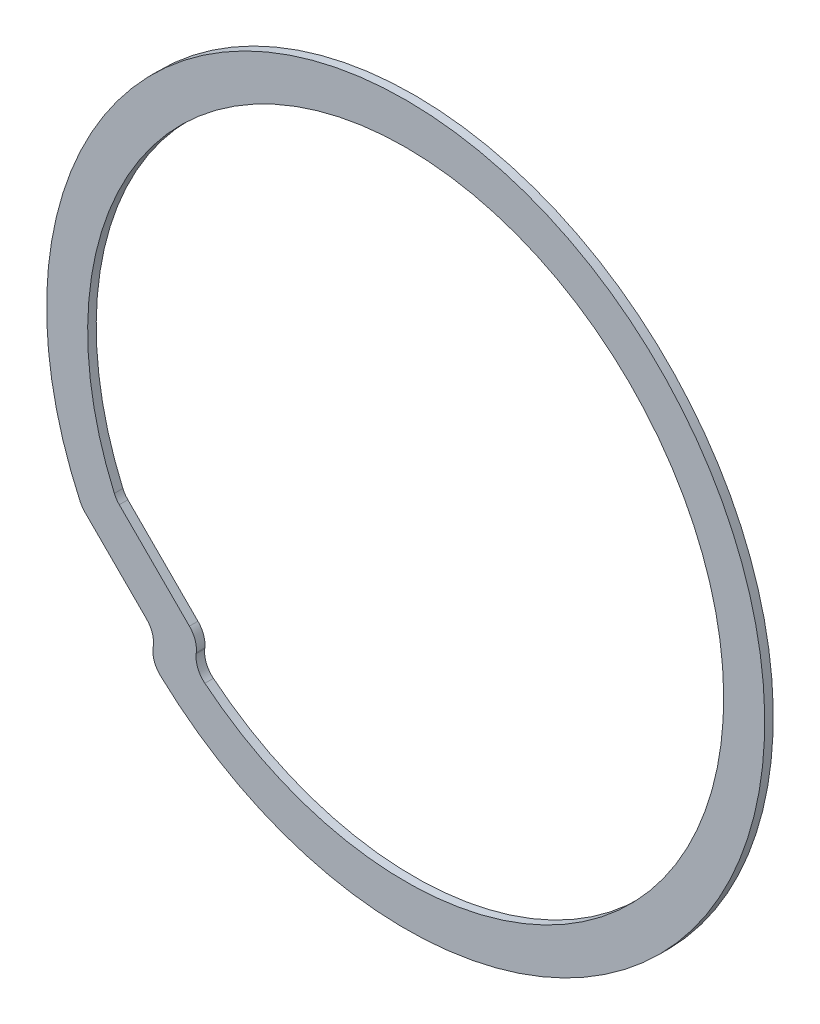
ISO-10303-21;
HEADER;
FILE_DESCRIPTION(('STEP AP214'),'2;1');
FILE_NAME('part.step','',(''),(''),'','','');
FILE_SCHEMA(('AUTOMOTIVE_DESIGN { 1 0 10303 214 1 1 1 1 }'));
ENDSEC;
DATA;
#1=APPLICATION_CONTEXT('core data for automotive mechanical design processes');
#2=APPLICATION_PROTOCOL_DEFINITION('international standard','automotive_design',2000,#1);
#3=PRODUCT_CONTEXT('',#1,'mechanical');
#4=PRODUCT('Part','Part','',(#3));
#5=PRODUCT_RELATED_PRODUCT_CATEGORY('part','',(#4));
#6=PRODUCT_DEFINITION_FORMATION('','',#4);
#7=PRODUCT_DEFINITION_CONTEXT('part definition',#1,'design');
#8=PRODUCT_DEFINITION('design','',#6,#7);
#9=PRODUCT_DEFINITION_SHAPE('','',#8);
#10=(LENGTH_UNIT() NAMED_UNIT(*) SI_UNIT(.MILLI.,.METRE.));
#11=(NAMED_UNIT(*) PLANE_ANGLE_UNIT() SI_UNIT($,.RADIAN.));
#12=(NAMED_UNIT(*) SI_UNIT($,.STERADIAN.) SOLID_ANGLE_UNIT());
#13=UNCERTAINTY_MEASURE_WITH_UNIT(LENGTH_MEASURE(1.E-05),#10,'distance_accuracy_value','');
#14=(GEOMETRIC_REPRESENTATION_CONTEXT(3) GLOBAL_UNCERTAINTY_ASSIGNED_CONTEXT((#13)) GLOBAL_UNIT_ASSIGNED_CONTEXT((#10,
#11,#12)) REPRESENTATION_CONTEXT('',''));
#15=CARTESIAN_POINT('',(0.,0.,0.));
#16=DIRECTION('',(0.,0.,1.));
#17=DIRECTION('',(1.,0.,0.));
#18=AXIS2_PLACEMENT_3D('',#15,#16,#17);
#19=CARTESIAN_POINT('',(-93.247183919653,-61.2132213627366,1.5875));
#20=DIRECTION('',(0.99410299247217,-0.108440031159511,0.));
#21=DIRECTION('',(0.108440031159511,0.99410299247217,0.));
#22=AXIS2_PLACEMENT_3D('',#19,#20,#21);
#23=PLANE('',#22);
#24=DIRECTION('',(-0.108440031159511,-0.99410299247217,0.));
#25=VECTOR('',#24,1.);
#26=CARTESIAN_POINT('',(-93.247183919653,-61.2132213627366,-1.5875));
#27=LINE('',#26,#25);
#28=CARTESIAN_POINT('',(-93.7093333479408,-65.4498867778762,-1.5875));
#29=VERTEX_POINT('',#28);
#30=CARTESIAN_POINT('',(-93.8206577530743,-66.4704317103622,-1.5875));
#31=VERTEX_POINT('',#30);
#32=EDGE_CURVE('E218',#29,#31,#27,.T.);
#33=ORIENTED_EDGE('',*,*,#32,.T.);
#34=DIRECTION('',(0.,0.,-1.));
#35=VECTOR('',#34,1.);
#36=CARTESIAN_POINT('',(-93.8206577530743,-66.4704317103622,1.5875));
#37=LINE('',#36,#35);
#38=CARTESIAN_POINT('',(-93.8206577530743,-66.4704317103622,1.5875));
#39=VERTEX_POINT('',#38);
#40=EDGE_CURVE('E52',#31,#39,#37,.F.);
#41=ORIENTED_EDGE('',*,*,#40,.T.);
#42=DIRECTION('',(-0.108440031159511,-0.99410299247217,0.));
#43=VECTOR('',#42,1.);
#44=CARTESIAN_POINT('',(-93.247183919653,-61.2132213627366,1.5875));
#45=LINE('',#44,#43);
#46=CARTESIAN_POINT('',(-93.7093333479408,-65.4498867778762,1.5875));
#47=VERTEX_POINT('',#46);
#48=EDGE_CURVE('E219',#47,#39,#45,.T.);
#49=ORIENTED_EDGE('',*,*,#48,.F.);
#50=DIRECTION('',(0.,0.,-1.));
#51=VECTOR('',#50,1.);
#52=CARTESIAN_POINT('',(-93.7093333479408,-65.4498867778762,-1.5875));
#53=LINE('',#52,#51);
#54=EDGE_CURVE('E179',#47,#29,#53,.T.);
#55=ORIENTED_EDGE('',*,*,#54,.T.);
#56=EDGE_LOOP('',(#33,#41,#49,#55));
#57=FACE_BOUND('',#56,.T.);
#58=ADVANCED_FACE('F37',(#57),#23,.F.);
#59=CARTESIAN_POINT('',(0.,23.495,1.5875));
#60=DIRECTION('',(0.,0.,-1.));
#61=DIRECTION('',(-1.,0.,0.));
#62=AXIS2_PLACEMENT_3D('',#59,#60,#61);
#63=CYLINDRICAL_SURFACE('',#62,133.35);
#64=CARTESIAN_POINT('',(0.,23.495,-1.5875));
#65=DIRECTION('',(0.,0.,1.));
#66=DIRECTION('',(1.,0.,0.));
#67=AXIS2_PLACEMENT_3D('',#64,#65,#66);
#68=CIRCLE('',#67,133.35);
#69=CARTESIAN_POINT('',(-91.0533023035679,-73.9294252721825,-1.5875));
#70=VERTEX_POINT('',#69);
#71=CARTESIAN_POINT('',(-120.870260590929,-32.8308608871707,-1.5875));
#72=VERTEX_POINT('',#71);
#73=EDGE_CURVE('E227',#70,#72,#68,.T.);
#74=ORIENTED_EDGE('',*,*,#73,.T.);
#75=DIRECTION('',(0.,0.,-1.));
#76=VECTOR('',#75,1.);
#77=CARTESIAN_POINT('',(-120.870260590929,-32.8308608871707,1.5875));
#78=LINE('',#77,#76);
#79=CARTESIAN_POINT('',(-120.870260590929,-32.8308608871707,1.5875));
#80=VERTEX_POINT('',#79);
#81=EDGE_CURVE('E171',#72,#80,#78,.F.);
#82=ORIENTED_EDGE('',*,*,#81,.T.);
#83=CARTESIAN_POINT('',(0.,23.495,1.5875));
#84=DIRECTION('',(0.,0.,1.));
#85=DIRECTION('',(1.,0.,0.));
#86=AXIS2_PLACEMENT_3D('',#83,#84,#85);
#87=CIRCLE('',#86,133.35);
#88=CARTESIAN_POINT('',(-91.0533023035679,-73.9294252721825,1.5875));
#89=VERTEX_POINT('',#88);
#90=EDGE_CURVE('E221',#89,#80,#87,.T.);
#91=ORIENTED_EDGE('',*,*,#90,.F.);
#92=DIRECTION('',(0.,0.,-1.));
#93=VECTOR('',#92,1.);
#94=CARTESIAN_POINT('',(-91.0533023035679,-73.9294252721825,1.5875));
#95=LINE('',#94,#93);
#96=EDGE_CURVE('E168',#89,#70,#95,.T.);
#97=ORIENTED_EDGE('',*,*,#96,.T.);
#98=EDGE_LOOP('',(#74,#82,#91,#97));
#99=FACE_BOUND('',#98,.T.);
#100=ADVANCED_FACE('F252',(#99),#63,.T.);
#101=CARTESIAN_POINT('',(-120.187952282861,-34.2724529995294,1.5875));
#102=DIRECTION('',(0.707106781186544,0.707106781186551,0.));
#103=DIRECTION('',(-0.707106781186551,0.707106781186544,0.));
#104=AXIS2_PLACEMENT_3D('',#101,#102,#103);
#105=PLANE('',#104);
#106=DIRECTION('',(0.707106781186551,-0.707106781186544,0.));
#107=VECTOR('',#106,1.);
#108=CARTESIAN_POINT('',(-120.187952282861,-34.2724529995294,1.5875));
#109=LINE('',#108,#107);
#110=CARTESIAN_POINT('',(-119.098422502949,-35.3619827794411,1.5875));
#111=VERTEX_POINT('',#110);
#112=CARTESIAN_POINT('',(-96.26072966627,-58.1996756161197,1.5875));
#113=VERTEX_POINT('',#112);
#114=EDGE_CURVE('E139',#111,#113,#109,.T.);
#115=ORIENTED_EDGE('',*,*,#114,.F.);
#116=DIRECTION('',(0.,0.,-1.));
#117=VECTOR('',#116,1.);
#118=CARTESIAN_POINT('',(-119.098422502949,-35.3619827794411,1.5875));
#119=LINE('',#118,#117);
#120=CARTESIAN_POINT('',(-119.098422502949,-35.3619827794411,-1.5875));
#121=VERTEX_POINT('',#120);
#122=EDGE_CURVE('E158',#111,#121,#119,.T.);
#123=ORIENTED_EDGE('',*,*,#122,.T.);
#124=DIRECTION('',(0.707106781186551,-0.707106781186544,0.));
#125=VECTOR('',#124,1.);
#126=CARTESIAN_POINT('',(-120.187952282861,-34.2724529995294,-1.5875));
#127=LINE('',#126,#125);
#128=CARTESIAN_POINT('',(-96.26072966627,-58.1996756161197,-1.5875));
#129=VERTEX_POINT('',#128);
#130=EDGE_CURVE('E222',#121,#129,#127,.T.);
#131=ORIENTED_EDGE('',*,*,#130,.T.);
#132=DIRECTION('',(0.,0.,-1.));
#133=VECTOR('',#132,1.);
#134=CARTESIAN_POINT('',(-96.26072966627,-58.1996756161197,1.5875));
#135=LINE('',#134,#133);
#136=EDGE_CURVE('E163',#129,#113,#135,.F.);
#137=ORIENTED_EDGE('',*,*,#136,.T.);
#138=EDGE_LOOP('',(#115,#123,#131,#137));
#139=FACE_BOUND('',#138,.T.);
#140=ADVANCED_FACE('F237',(#139),#105,.F.);
#141=CARTESIAN_POINT('',(0.,23.495,1.5875));
#142=DIRECTION('',(0.,0.,1.));
#143=DIRECTION('',(1.,0.,0.));
#144=AXIS2_PLACEMENT_3D('',#141,#142,#143);
#145=PLANE('',#144);
#146=DIRECTION('',(-0.108440031159515,-0.99410299247217,0.));
#147=VECTOR('',#146,1.);
#148=CARTESIAN_POINT('',(-77.3047981515981,-55.6029924402255,1.5875));
#149=LINE('',#148,#147);
#150=CARTESIAN_POINT('',(-77.7669475798859,-59.8396578553651,1.5875));
#151=VERTEX_POINT('',#150);
#152=CARTESIAN_POINT('',(-77.809318089614,-60.2280813006821,1.5875));
#153=VERTEX_POINT('',#152);
#154=EDGE_CURVE('E196',#151,#153,#149,.T.);
#155=ORIENTED_EDGE('',*,*,#154,.F.);
#156=CARTESIAN_POINT('',(-86.6045231829635,-58.875625978357,1.58750000000002));
#157=DIRECTION('',(0.,0.,1.));
#158=DIRECTION('',(1.,0.,0.));
#159=AXIS2_PLACEMENT_3D('',#156,#157,#158);
#160=CIRCLE('',#159,8.89);
#161=CARTESIAN_POINT('',(-80.3183438982151,-52.5894466936086,1.5875));
#162=VERTEX_POINT('',#161);
#163=EDGE_CURVE('E173',#151,#162,#160,.T.);
#164=ORIENTED_EDGE('',*,*,#163,.T.);
#165=DIRECTION('',(0.707106781186551,-0.707106781186544,0.));
#166=VECTOR('',#165,1.);
#167=CARTESIAN_POINT('',(-107.519100249958,-25.3886903418656,1.5875));
#168=LINE('',#167,#166);
#169=CARTESIAN_POINT('',(-106.356428701463,-26.5513618903612,1.5875));
#170=VERTEX_POINT('',#169);
#171=EDGE_CURVE('E135',#170,#162,#168,.T.);
#172=ORIENTED_EDGE('',*,*,#171,.F.);
#173=CARTESIAN_POINT('',(-100.070249416714,-20.2651826056127,1.58750000000002));
#174=DIRECTION('',(0.,0.,1.));
#175=DIRECTION('',(1.,0.,0.));
#176=AXIS2_PLACEMENT_3D('',#173,#174,#175);
#177=CIRCLE('',#176,8.89);
#178=CARTESIAN_POINT('',(-108.215502276214,-23.8270579339765,1.5875));
#179=VERTEX_POINT('',#178);
#180=EDGE_CURVE('E186',#170,#179,#177,.F.);
#181=ORIENTED_EDGE('',*,*,#180,.T.);
#182=CARTESIAN_POINT('',(0.,23.495,1.5875));
#183=DIRECTION('',(0.,0.,1.));
#184=DIRECTION('',(1.,0.,0.));
#185=AXIS2_PLACEMENT_3D('',#182,#183,#184);
#186=CIRCLE('',#185,118.11);
#187=CARTESIAN_POINT('',(-74.5857215261382,-68.0852502968045,1.5875));
#188=VERTEX_POINT('',#187);
#189=EDGE_CURVE('E198',#188,#179,#186,.T.);
#190=ORIENTED_EDGE('',*,*,#189,.F.);
#191=CARTESIAN_POINT('',(-68.9717424865364,-61.1921131776902,1.58750000000002));
#192=DIRECTION('',(0.,0.,1.));
#193=DIRECTION('',(1.,0.,0.));
#194=AXIS2_PLACEMENT_3D('',#191,#192,#193);
#195=CIRCLE('',#194,8.89);
#196=EDGE_CURVE('E45',#188,#153,#195,.F.);
#197=ORIENTED_EDGE('',*,*,#196,.T.);
#198=EDGE_LOOP('',(#155,#164,#172,#181,#190,#197));
#199=FACE_BOUND('',#198,.T.);
#200=ORIENTED_EDGE('',*,*,#90,.T.);
#201=CARTESIAN_POINT('',(-112.8122432182,-29.0758034946927,1.5875));
#202=DIRECTION('',(0.,0.,1.));
#203=DIRECTION('',(1.,0.,0.));
#204=AXIS2_PLACEMENT_3D('',#201,#202,#203);
#205=CIRCLE('',#204,8.89);
#206=EDGE_CURVE('E177',#80,#111,#205,.T.);
#207=ORIENTED_EDGE('',*,*,#206,.T.);
#208=ORIENTED_EDGE('',*,*,#114,.T.);
#209=CARTESIAN_POINT('',(-102.546908951018,-64.4858549008681,1.5875));
#210=DIRECTION('',(0.,0.,1.));
#211=DIRECTION('',(1.,0.,0.));
#212=AXIS2_PLACEMENT_3D('',#209,#210,#211);
#213=CIRCLE('',#212,8.89);
#214=EDGE_CURVE('E59',#113,#47,#213,.F.);
#215=ORIENTED_EDGE('',*,*,#214,.T.);
#216=ORIENTED_EDGE('',*,*,#48,.T.);
#217=CARTESIAN_POINT('',(-84.9830821499967,-67.4344635873703,1.5875));
#218=DIRECTION('',(0.,0.,1.));
#219=DIRECTION('',(1.,0.,0.));
#220=AXIS2_PLACEMENT_3D('',#217,#218,#219);
#221=CIRCLE('',#220,8.89);
#222=EDGE_CURVE('E175',#39,#89,#221,.T.);
#223=ORIENTED_EDGE('',*,*,#222,.T.);
#224=EDGE_LOOP('',(#200,#207,#208,#215,#216,#223));
#225=FACE_BOUND('',#224,.T.);
#226=ADVANCED_FACE('F195',(#199,#225),#145,.T.);
#227=CARTESIAN_POINT('',(0.,23.495,-1.5875));
#228=DIRECTION('',(0.,0.,1.));
#229=DIRECTION('',(1.,0.,0.));
#230=AXIS2_PLACEMENT_3D('',#227,#228,#229);
#231=PLANE('',#230);
#232=DIRECTION('',(-0.707106781186551,0.707106781186544,0.));
#233=VECTOR('',#232,1.);
#234=CARTESIAN_POINT('',(-107.519100249958,-25.3886903418656,-1.58750000000002));
#235=LINE('',#234,#233);
#236=CARTESIAN_POINT('',(-80.3183438982151,-52.5894466936086,-1.58750000000002));
#237=VERTEX_POINT('',#236);
#238=CARTESIAN_POINT('',(-106.356428701463,-26.5513618903612,-1.58750000000002));
#239=VERTEX_POINT('',#238);
#240=EDGE_CURVE('E132',#237,#239,#235,.T.);
#241=ORIENTED_EDGE('',*,*,#240,.F.);
#242=CARTESIAN_POINT('',(-86.6045231829635,-58.875625978357,-1.58750000000002));
#243=DIRECTION('',(0.,0.,1.));
#244=DIRECTION('',(1.,0.,0.));
#245=AXIS2_PLACEMENT_3D('',#242,#243,#244);
#246=CIRCLE('',#245,8.89);
#247=CARTESIAN_POINT('',(-77.7669475798859,-59.8396578553651,-1.58750000000002));
#248=VERTEX_POINT('',#247);
#249=EDGE_CURVE('E145',#237,#248,#246,.F.);
#250=ORIENTED_EDGE('',*,*,#249,.T.);
#251=DIRECTION('',(0.108440031159515,0.99410299247217,0.));
#252=VECTOR('',#251,1.);
#253=CARTESIAN_POINT('',(-77.3047981515981,-55.6029924402255,-1.58750000000002));
#254=LINE('',#253,#252);
#255=CARTESIAN_POINT('',(-77.809318089614,-60.2280813006821,-1.58750000000002));
#256=VERTEX_POINT('',#255);
#257=EDGE_CURVE('E150',#256,#248,#254,.T.);
#258=ORIENTED_EDGE('',*,*,#257,.F.);
#259=CARTESIAN_POINT('',(-68.9717424865364,-61.1921131776902,-1.58750000000002));
#260=DIRECTION('',(0.,0.,1.));
#261=DIRECTION('',(1.,0.,0.));
#262=AXIS2_PLACEMENT_3D('',#259,#260,#261);
#263=CIRCLE('',#262,8.89);
#264=CARTESIAN_POINT('',(-74.5857215261382,-68.0852502968045,-1.58750000000002));
#265=VERTEX_POINT('',#264);
#266=EDGE_CURVE('E11',#256,#265,#263,.T.);
#267=ORIENTED_EDGE('',*,*,#266,.T.);
#268=CARTESIAN_POINT('',(0.,23.495,-1.58750000000002));
#269=DIRECTION('',(0.,0.,1.));
#270=DIRECTION('',(1.,0.,0.));
#271=AXIS2_PLACEMENT_3D('',#268,#269,#270);
#272=CIRCLE('',#271,118.11);
#273=CARTESIAN_POINT('',(-108.215502276214,-23.8270579339765,-1.58750000000002));
#274=VERTEX_POINT('',#273);
#275=EDGE_CURVE('E151',#274,#265,#272,.F.);
#276=ORIENTED_EDGE('',*,*,#275,.F.);
#277=CARTESIAN_POINT('',(-100.070249416714,-20.2651826056127,-1.58750000000002));
#278=DIRECTION('',(0.,0.,1.));
#279=DIRECTION('',(1.,0.,0.));
#280=AXIS2_PLACEMENT_3D('',#277,#278,#279);
#281=CIRCLE('',#280,8.89);
#282=EDGE_CURVE('E149',#274,#239,#281,.T.);
#283=ORIENTED_EDGE('',*,*,#282,.T.);
#284=EDGE_LOOP('',(#241,#250,#258,#267,#276,#283));
#285=FACE_BOUND('',#284,.T.);
#286=ORIENTED_EDGE('',*,*,#130,.F.);
#287=CARTESIAN_POINT('',(-112.8122432182,-29.0758034946927,-1.5875));
#288=DIRECTION('',(0.,0.,1.));
#289=DIRECTION('',(1.,0.,0.));
#290=AXIS2_PLACEMENT_3D('',#287,#288,#289);
#291=CIRCLE('',#290,8.89);
#292=EDGE_CURVE('E160',#121,#72,#291,.F.);
#293=ORIENTED_EDGE('',*,*,#292,.T.);
#294=ORIENTED_EDGE('',*,*,#73,.F.);
#295=CARTESIAN_POINT('',(-84.9830821499967,-67.4344635873703,-1.5875));
#296=DIRECTION('',(0.,0.,1.));
#297=DIRECTION('',(1.,0.,0.));
#298=AXIS2_PLACEMENT_3D('',#295,#296,#297);
#299=CIRCLE('',#298,8.89);
#300=EDGE_CURVE('E157',#70,#31,#299,.F.);
#301=ORIENTED_EDGE('',*,*,#300,.T.);
#302=ORIENTED_EDGE('',*,*,#32,.F.);
#303=CARTESIAN_POINT('',(-102.546908951018,-64.4858549008681,-1.5875));
#304=DIRECTION('',(0.,0.,1.));
#305=DIRECTION('',(1.,0.,0.));
#306=AXIS2_PLACEMENT_3D('',#303,#304,#305);
#307=CIRCLE('',#306,8.89);
#308=EDGE_CURVE('E189',#29,#129,#307,.T.);
#309=ORIENTED_EDGE('',*,*,#308,.T.);
#310=EDGE_LOOP('',(#286,#293,#294,#301,#302,#309));
#311=FACE_BOUND('',#310,.T.);
#312=ADVANCED_FACE('F142',(#285,#311),#231,.F.);
#313=CARTESIAN_POINT('',(-107.519100249958,-25.3886903418656,-335.653027703772));
#314=DIRECTION('',(-0.707106781186544,-0.707106781186551,0.));
#315=DIRECTION('',(0.707106781186551,-0.707106781186544,0.));
#316=AXIS2_PLACEMENT_3D('',#313,#314,#315);
#317=PLANE('',#316);
#318=ORIENTED_EDGE('',*,*,#240,.T.);
#319=DIRECTION('',(0.,0.,-1.));
#320=VECTOR('',#319,1.);
#321=CARTESIAN_POINT('',(-106.356428701463,-26.5513618903612,1.58750000000002));
#322=LINE('',#321,#320);
#323=EDGE_CURVE('E138',#239,#170,#322,.F.);
#324=ORIENTED_EDGE('',*,*,#323,.T.);
#325=ORIENTED_EDGE('',*,*,#171,.T.);
#326=DIRECTION('',(0.,0.,1.));
#327=VECTOR('',#326,1.);
#328=CARTESIAN_POINT('',(-80.3183438982151,-52.5894466936086,-335.653027703772));
#329=LINE('',#328,#327);
#330=EDGE_CURVE('E128',#162,#237,#329,.F.);
#331=ORIENTED_EDGE('',*,*,#330,.T.);
#332=EDGE_LOOP('',(#318,#324,#325,#331));
#333=FACE_BOUND('',#332,.T.);
#334=ADVANCED_FACE('F130',(#333),#317,.F.);
#335=CARTESIAN_POINT('',(0.,23.495,-335.653027703772));
#336=DIRECTION('',(0.,0.,1.));
#337=DIRECTION('',(1.,0.,0.));
#338=AXIS2_PLACEMENT_3D('',#335,#336,#337);
#339=CYLINDRICAL_SURFACE('',#338,118.11);
#340=ORIENTED_EDGE('',*,*,#189,.T.);
#341=DIRECTION('',(0.,0.,1.));
#342=VECTOR('',#341,1.);
#343=CARTESIAN_POINT('',(-108.215502276214,-23.8270579339765,-335.653027703772));
#344=LINE('',#343,#342);
#345=EDGE_CURVE('E212',#179,#274,#344,.F.);
#346=ORIENTED_EDGE('',*,*,#345,.T.);
#347=ORIENTED_EDGE('',*,*,#275,.T.);
#348=DIRECTION('',(0.,0.,1.));
#349=VECTOR('',#348,1.);
#350=CARTESIAN_POINT('',(-74.5857215261382,-68.0852502968045,-335.653027703772));
#351=LINE('',#350,#349);
#352=EDGE_CURVE('E207',#265,#188,#351,.T.);
#353=ORIENTED_EDGE('',*,*,#352,.T.);
#354=EDGE_LOOP('',(#340,#346,#347,#353));
#355=FACE_BOUND('',#354,.T.);
#356=ADVANCED_FACE('F210',(#355),#339,.F.);
#357=CARTESIAN_POINT('',(-77.3047981515981,-55.6029924402255,-335.653027703772));
#358=DIRECTION('',(-0.99410299247217,0.108440031159515,0.));
#359=DIRECTION('',(-0.108440031159515,-0.99410299247217,0.));
#360=AXIS2_PLACEMENT_3D('',#357,#358,#359);
#361=PLANE('',#360);
#362=ORIENTED_EDGE('',*,*,#257,.T.);
#363=DIRECTION('',(0.,0.,1.));
#364=VECTOR('',#363,1.);
#365=CARTESIAN_POINT('',(-77.7669475798859,-59.8396578553651,-335.653027703772));
#366=LINE('',#365,#364);
#367=EDGE_CURVE('E156',#248,#151,#366,.T.);
#368=ORIENTED_EDGE('',*,*,#367,.T.);
#369=ORIENTED_EDGE('',*,*,#154,.T.);
#370=DIRECTION('',(0.,0.,-1.));
#371=VECTOR('',#370,1.);
#372=CARTESIAN_POINT('',(-77.809318089614,-60.2280813006821,-1.58750000000002));
#373=LINE('',#372,#371);
#374=EDGE_CURVE('E183',#153,#256,#373,.T.);
#375=ORIENTED_EDGE('',*,*,#374,.T.);
#376=EDGE_LOOP('',(#362,#368,#369,#375));
#377=FACE_BOUND('',#376,.T.);
#378=ADVANCED_FACE('F204',(#377),#361,.F.);
#379=CARTESIAN_POINT('',(-100.070249416714,-20.2651826056127,-335.653027703772));
#380=DIRECTION('',(0.,0.,1.));
#381=DIRECTION('',(1.,0.,0.));
#382=AXIS2_PLACEMENT_3D('',#379,#380,#381);
#383=CYLINDRICAL_SURFACE('',#382,8.89);
#384=ORIENTED_EDGE('',*,*,#282,.F.);
#385=ORIENTED_EDGE('',*,*,#345,.F.);
#386=ORIENTED_EDGE('',*,*,#180,.F.);
#387=ORIENTED_EDGE('',*,*,#323,.F.);
#388=EDGE_LOOP('',(#384,#385,#386,#387));
#389=FACE_BOUND('',#388,.T.);
#390=ADVANCED_FACE('F257',(#389),#383,.F.);
#391=CARTESIAN_POINT('',(-112.8122432182,-29.0758034946927,1.5875));
#392=DIRECTION('',(0.,0.,-1.));
#393=DIRECTION('',(-1.,0.,0.));
#394=AXIS2_PLACEMENT_3D('',#391,#392,#393);
#395=CYLINDRICAL_SURFACE('',#394,8.89);
#396=ORIENTED_EDGE('',*,*,#206,.F.);
#397=ORIENTED_EDGE('',*,*,#81,.F.);
#398=ORIENTED_EDGE('',*,*,#292,.F.);
#399=ORIENTED_EDGE('',*,*,#122,.F.);
#400=EDGE_LOOP('',(#396,#397,#398,#399));
#401=FACE_BOUND('',#400,.T.);
#402=ADVANCED_FACE('F255',(#401),#395,.T.);
#403=CARTESIAN_POINT('',(-84.9830821499967,-67.4344635873703,1.5875));
#404=DIRECTION('',(0.,0.,-1.));
#405=DIRECTION('',(-1.,0.,0.));
#406=AXIS2_PLACEMENT_3D('',#403,#404,#405);
#407=CYLINDRICAL_SURFACE('',#406,8.89);
#408=ORIENTED_EDGE('',*,*,#222,.F.);
#409=ORIENTED_EDGE('',*,*,#40,.F.);
#410=ORIENTED_EDGE('',*,*,#300,.F.);
#411=ORIENTED_EDGE('',*,*,#96,.F.);
#412=EDGE_LOOP('',(#408,#409,#410,#411));
#413=FACE_BOUND('',#412,.T.);
#414=ADVANCED_FACE('F249',(#413),#407,.T.);
#415=CARTESIAN_POINT('',(-102.546908951018,-64.4858549008681,1.5875));
#416=DIRECTION('',(0.,0.,1.));
#417=DIRECTION('',(1.,0.,0.));
#418=AXIS2_PLACEMENT_3D('',#415,#416,#417);
#419=CYLINDRICAL_SURFACE('',#418,8.89);
#420=ORIENTED_EDGE('',*,*,#214,.F.);
#421=ORIENTED_EDGE('',*,*,#136,.F.);
#422=ORIENTED_EDGE('',*,*,#308,.F.);
#423=ORIENTED_EDGE('',*,*,#54,.F.);
#424=EDGE_LOOP('',(#420,#421,#422,#423));
#425=FACE_BOUND('',#424,.T.);
#426=ADVANCED_FACE('F243',(#425),#419,.F.);
#427=CARTESIAN_POINT('',(-86.6045231829635,-58.875625978357,-335.653027703772));
#428=DIRECTION('',(0.,0.,1.));
#429=DIRECTION('',(1.,0.,0.));
#430=AXIS2_PLACEMENT_3D('',#427,#428,#429);
#431=CYLINDRICAL_SURFACE('',#430,8.89);
#432=ORIENTED_EDGE('',*,*,#249,.F.);
#433=ORIENTED_EDGE('',*,*,#330,.F.);
#434=ORIENTED_EDGE('',*,*,#163,.F.);
#435=ORIENTED_EDGE('',*,*,#367,.F.);
#436=EDGE_LOOP('',(#432,#433,#434,#435));
#437=FACE_BOUND('',#436,.T.);
#438=ADVANCED_FACE('F154',(#437),#431,.T.);
#439=CARTESIAN_POINT('',(-68.9717424865364,-61.1921131776902,-335.653027703772));
#440=DIRECTION('',(0.,0.,1.));
#441=DIRECTION('',(1.,0.,0.));
#442=AXIS2_PLACEMENT_3D('',#439,#440,#441);
#443=CYLINDRICAL_SURFACE('',#442,8.89);
#444=ORIENTED_EDGE('',*,*,#266,.F.);
#445=ORIENTED_EDGE('',*,*,#374,.F.);
#446=ORIENTED_EDGE('',*,*,#196,.F.);
#447=ORIENTED_EDGE('',*,*,#352,.F.);
#448=EDGE_LOOP('',(#444,#445,#446,#447));
#449=FACE_BOUND('',#448,.T.);
#450=ADVANCED_FACE('F39',(#449),#443,.F.);
#451=CLOSED_SHELL('',(#58,#100,#140,#226,#312,#334,#356,#378,#390,#402,#414,#426,#438,#450));
#452=MANIFOLD_SOLID_BREP('B2',#451);
#453=ADVANCED_BREP_SHAPE_REPRESENTATION('',(#18,#452),#14);
#454=SHAPE_DEFINITION_REPRESENTATION(#9,#453);
ENDSEC;
END-ISO-10303-21;
